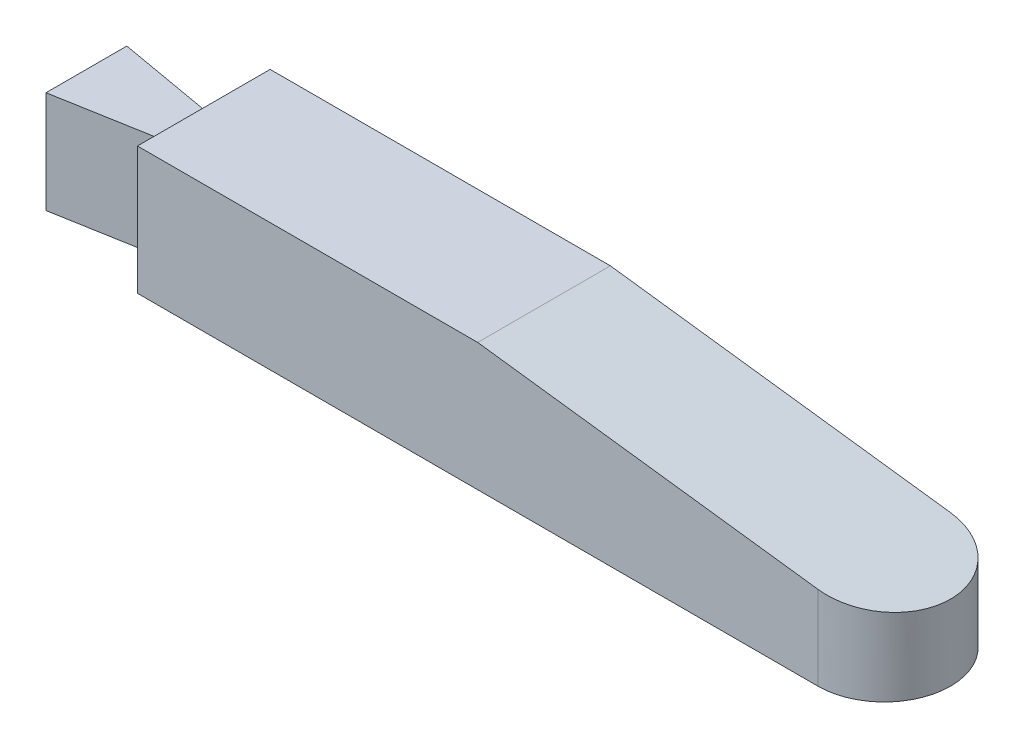
ISO-10303-21;
HEADER;
FILE_DESCRIPTION(('STEP AP214'),'2;1');
FILE_NAME('part.step','',(''),(''),'','','');
FILE_SCHEMA(('AUTOMOTIVE_DESIGN { 1 0 10303 214 1 1 1 1 }'));
ENDSEC;
DATA;
#1=APPLICATION_CONTEXT('core data for automotive mechanical design processes');
#2=APPLICATION_PROTOCOL_DEFINITION('international standard','automotive_design',2000,#1);
#3=PRODUCT_CONTEXT('',#1,'mechanical');
#4=PRODUCT('Part','Part','',(#3));
#5=PRODUCT_RELATED_PRODUCT_CATEGORY('part','',(#4));
#6=PRODUCT_DEFINITION_FORMATION('','',#4);
#7=PRODUCT_DEFINITION_CONTEXT('part definition',#1,'design');
#8=PRODUCT_DEFINITION('design','',#6,#7);
#9=PRODUCT_DEFINITION_SHAPE('','',#8);
#10=(LENGTH_UNIT() NAMED_UNIT(*) SI_UNIT(.MILLI.,.METRE.));
#11=(NAMED_UNIT(*) PLANE_ANGLE_UNIT() SI_UNIT($,.RADIAN.));
#12=(NAMED_UNIT(*) SI_UNIT($,.STERADIAN.) SOLID_ANGLE_UNIT());
#13=UNCERTAINTY_MEASURE_WITH_UNIT(LENGTH_MEASURE(1.E-05),#10,'distance_accuracy_value','');
#14=(GEOMETRIC_REPRESENTATION_CONTEXT(3) GLOBAL_UNCERTAINTY_ASSIGNED_CONTEXT((#13)) GLOBAL_UNIT_ASSIGNED_CONTEXT((#10,
#11,#12)) REPRESENTATION_CONTEXT('',''));
#15=CARTESIAN_POINT('',(0.,0.,0.));
#16=DIRECTION('',(0.,0.,1.));
#17=DIRECTION('',(1.,0.,0.));
#18=AXIS2_PLACEMENT_3D('',#15,#16,#17);
#19=CARTESIAN_POINT('',(-35.052,38.1,7.74700000000001));
#20=DIRECTION('',(-0.173648177666927,0.,0.984807753012209));
#21=DIRECTION('',(0.984807753012209,0.,0.173648177666927));
#22=AXIS2_PLACEMENT_3D('',#19,#20,#21);
#23=PLANE('',#22);
#24=DIRECTION('',(-0.984807753012209,0.,-0.173648177666928));
#25=VECTOR('',#24,1.);
#26=CARTESIAN_POINT('',(0.,30.48,13.927613327793));
#27=LINE('',#26,#25);
#28=CARTESIAN_POINT('',(0.,30.48,13.927613327793));
#29=VERTEX_POINT('',#28);
#30=CARTESIAN_POINT('',(-35.052,30.48,7.74700000000001));
#31=VERTEX_POINT('',#30);
#32=EDGE_CURVE('E198',#29,#31,#27,.T.);
#33=ORIENTED_EDGE('',*,*,#32,.F.);
#34=DIRECTION('',(0.,-1.,0.));
#35=VECTOR('',#34,1.);
#36=CARTESIAN_POINT('',(0.,38.1,13.927613327793));
#37=LINE('',#36,#35);
#38=CARTESIAN_POINT('',(0.,0.,13.927613327793));
#39=VERTEX_POINT('',#38);
#40=EDGE_CURVE('E11',#29,#39,#37,.T.);
#41=ORIENTED_EDGE('',*,*,#40,.T.);
#42=DIRECTION('',(-0.984807753012209,0.,-0.173648177666928));
#43=VECTOR('',#42,1.);
#44=CARTESIAN_POINT('',(-35.052,0.,7.74700000000001));
#45=LINE('',#44,#43);
#46=CARTESIAN_POINT('',(-35.052,0.,7.74700000000001));
#47=VERTEX_POINT('',#46);
#48=EDGE_CURVE('E124',#39,#47,#45,.T.);
#49=ORIENTED_EDGE('',*,*,#48,.T.);
#50=DIRECTION('',(0.,-1.,0.));
#51=VECTOR('',#50,1.);
#52=CARTESIAN_POINT('',(-35.052,38.1,7.74700000000001));
#53=LINE('',#52,#51);
#54=EDGE_CURVE('E53',#31,#47,#53,.T.);
#55=ORIENTED_EDGE('',*,*,#54,.F.);
#56=EDGE_LOOP('',(#33,#41,#49,#55));
#57=FACE_BOUND('',#56,.T.);
#58=ADVANCED_FACE('F45',(#57),#23,.F.);
#59=CARTESIAN_POINT('',(-35.052,38.1,7.74700000000001));
#60=DIRECTION('',(1.,0.,0.));
#61=DIRECTION('',(0.,0.,-1.));
#62=AXIS2_PLACEMENT_3D('',#59,#60,#61);
#63=PLANE('',#62);
#64=DIRECTION('',(0.,0.,1.));
#65=VECTOR('',#64,1.);
#66=CARTESIAN_POINT('',(-35.052,30.48,7.74700000000001));
#67=LINE('',#66,#65);
#68=CARTESIAN_POINT('',(-35.052,30.48,31.877));
#69=VERTEX_POINT('',#68);
#70=EDGE_CURVE('E177',#31,#69,#67,.T.);
#71=ORIENTED_EDGE('',*,*,#70,.F.);
#72=ORIENTED_EDGE('',*,*,#54,.T.);
#73=DIRECTION('',(0.,0.,1.));
#74=VECTOR('',#73,1.);
#75=CARTESIAN_POINT('',(-35.052,0.,7.74700000000001));
#76=LINE('',#75,#74);
#77=CARTESIAN_POINT('',(-35.052,0.,31.877));
#78=VERTEX_POINT('',#77);
#79=EDGE_CURVE('E130',#47,#78,#76,.T.);
#80=ORIENTED_EDGE('',*,*,#79,.T.);
#81=DIRECTION('',(0.,-1.,0.));
#82=VECTOR('',#81,1.);
#83=CARTESIAN_POINT('',(-35.052,38.1,31.877));
#84=LINE('',#83,#82);
#85=EDGE_CURVE('E166',#69,#78,#84,.T.);
#86=ORIENTED_EDGE('',*,*,#85,.F.);
#87=EDGE_LOOP('',(#71,#72,#80,#86));
#88=FACE_BOUND('',#87,.T.);
#89=ADVANCED_FACE('F172',(#88),#63,.F.);
#90=CARTESIAN_POINT('',(-35.052,38.1,31.877));
#91=DIRECTION('',(-0.173648177666928,0.,-0.984807753012209));
#92=DIRECTION('',(-0.984807753012209,0.,0.173648177666928));
#93=AXIS2_PLACEMENT_3D('',#90,#91,#92);
#94=PLANE('',#93);
#95=DIRECTION('',(0.984807753012208,0.,-0.173648177666928));
#96=VECTOR('',#95,1.);
#97=CARTESIAN_POINT('',(-35.052,30.48,31.877));
#98=LINE('',#97,#96);
#99=CARTESIAN_POINT('',(0.,30.48,25.696386672207));
#100=VERTEX_POINT('',#99);
#101=EDGE_CURVE('E133',#69,#100,#98,.T.);
#102=ORIENTED_EDGE('',*,*,#101,.F.);
#103=ORIENTED_EDGE('',*,*,#85,.T.);
#104=DIRECTION('',(0.984807753012208,0.,-0.173648177666928));
#105=VECTOR('',#104,1.);
#106=CARTESIAN_POINT('',(-35.052,0.,31.877));
#107=LINE('',#106,#105);
#108=CARTESIAN_POINT('',(0.,0.,25.696386672207));
#109=VERTEX_POINT('',#108);
#110=EDGE_CURVE('E141',#78,#109,#107,.T.);
#111=ORIENTED_EDGE('',*,*,#110,.T.);
#112=DIRECTION('',(0.,-1.,0.));
#113=VECTOR('',#112,1.);
#114=CARTESIAN_POINT('',(0.,38.1,25.696386672207));
#115=LINE('',#114,#113);
#116=EDGE_CURVE('E163',#100,#109,#115,.T.);
#117=ORIENTED_EDGE('',*,*,#116,.F.);
#118=EDGE_LOOP('',(#102,#103,#111,#117));
#119=FACE_BOUND('',#118,.T.);
#120=ADVANCED_FACE('F185',(#119),#94,.F.);
#121=CARTESIAN_POINT('',(0.,38.1,39.624));
#122=DIRECTION('',(1.,0.,0.));
#123=DIRECTION('',(0.,0.,-1.));
#124=AXIS2_PLACEMENT_3D('',#121,#122,#123);
#125=PLANE('',#124);
#126=DIRECTION('',(0.,0.,1.));
#127=VECTOR('',#126,1.);
#128=CARTESIAN_POINT('',(0.,0.,39.624));
#129=LINE('',#128,#127);
#130=CARTESIAN_POINT('',(0.,0.,39.624));
#131=VERTEX_POINT('',#130);
#132=EDGE_CURVE('E145',#109,#131,#129,.T.);
#133=ORIENTED_EDGE('',*,*,#132,.T.);
#134=DIRECTION('',(0.,-1.,0.));
#135=VECTOR('',#134,1.);
#136=CARTESIAN_POINT('',(0.,38.1,39.624));
#137=LINE('',#136,#135);
#138=CARTESIAN_POINT('',(0.,38.1,39.624));
#139=VERTEX_POINT('',#138);
#140=EDGE_CURVE('E159',#139,#131,#137,.T.);
#141=ORIENTED_EDGE('',*,*,#140,.F.);
#142=DIRECTION('',(0.,0.,1.));
#143=VECTOR('',#142,1.);
#144=CARTESIAN_POINT('',(0.,38.1,0.));
#145=LINE('',#144,#143);
#146=CARTESIAN_POINT('',(0.,38.1,0.));
#147=VERTEX_POINT('',#146);
#148=EDGE_CURVE('E109',#147,#139,#145,.T.);
#149=ORIENTED_EDGE('',*,*,#148,.F.);
#150=DIRECTION('',(0.,-1.,0.));
#151=VECTOR('',#150,1.);
#152=CARTESIAN_POINT('',(0.,38.1,0.));
#153=LINE('',#152,#151);
#154=CARTESIAN_POINT('',(0.,0.,0.));
#155=VERTEX_POINT('',#154);
#156=EDGE_CURVE('E100',#147,#155,#153,.T.);
#157=ORIENTED_EDGE('',*,*,#156,.T.);
#158=DIRECTION('',(0.,0.,1.));
#159=VECTOR('',#158,1.);
#160=CARTESIAN_POINT('',(0.,0.,0.));
#161=LINE('',#160,#159);
#162=EDGE_CURVE('E116',#155,#39,#161,.T.);
#163=ORIENTED_EDGE('',*,*,#162,.T.);
#164=ORIENTED_EDGE('',*,*,#40,.F.);
#165=DIRECTION('',(0.,0.,-1.));
#166=VECTOR('',#165,1.);
#167=CARTESIAN_POINT('',(0.,30.48,25.696386672207));
#168=LINE('',#167,#166);
#169=EDGE_CURVE('E126',#100,#29,#168,.T.);
#170=ORIENTED_EDGE('',*,*,#169,.F.);
#171=ORIENTED_EDGE('',*,*,#116,.T.);
#172=EDGE_LOOP('',(#133,#141,#149,#157,#163,#164,#170,#171));
#173=FACE_BOUND('',#172,.T.);
#174=ADVANCED_FACE('F114',(#173),#125,.F.);
#175=CARTESIAN_POINT('',(0.,38.1,39.624));
#176=DIRECTION('',(0.,0.,-1.));
#177=DIRECTION('',(-1.,0.,0.));
#178=AXIS2_PLACEMENT_3D('',#175,#176,#177);
#179=PLANE('',#178);
#180=DIRECTION('',(0.,-1.,0.));
#181=VECTOR('',#180,1.);
#182=CARTESIAN_POINT('',(203.2,38.1,39.6239999999999));
#183=LINE('',#182,#181);
#184=CARTESIAN_POINT('',(203.2,25.062054565206,39.624));
#185=VERTEX_POINT('',#184);
#186=CARTESIAN_POINT('',(203.2,0.,39.6239999999999));
#187=VERTEX_POINT('',#186);
#188=EDGE_CURVE('E156',#185,#187,#183,.T.);
#189=ORIENTED_EDGE('',*,*,#188,.F.);
#190=DIRECTION('',(0.99186650650236,-0.127282493999779,0.));
#191=VECTOR('',#190,1.);
#192=CARTESIAN_POINT('',(101.6,38.1,39.624));
#193=LINE('',#192,#191);
#194=CARTESIAN_POINT('',(101.6,38.1,39.624));
#195=VERTEX_POINT('',#194);
#196=EDGE_CURVE('E227',#195,#185,#193,.T.);
#197=ORIENTED_EDGE('',*,*,#196,.F.);
#198=DIRECTION('',(1.,0.,0.));
#199=VECTOR('',#198,1.);
#200=CARTESIAN_POINT('',(0.,38.1,39.624));
#201=LINE('',#200,#199);
#202=EDGE_CURVE('E213',#139,#195,#201,.T.);
#203=ORIENTED_EDGE('',*,*,#202,.F.);
#204=ORIENTED_EDGE('',*,*,#140,.T.);
#205=DIRECTION('',(1.,0.,0.));
#206=VECTOR('',#205,1.);
#207=CARTESIAN_POINT('',(0.,0.,39.624));
#208=LINE('',#207,#206);
#209=EDGE_CURVE('E148',#131,#187,#208,.T.);
#210=ORIENTED_EDGE('',*,*,#209,.T.);
#211=EDGE_LOOP('',(#189,#197,#203,#204,#210));
#212=FACE_BOUND('',#211,.T.);
#213=ADVANCED_FACE('F225',(#212),#179,.F.);
#214=CARTESIAN_POINT('',(203.2,38.1,19.812));
#215=DIRECTION('',(0.,-1.,0.));
#216=DIRECTION('',(0.,0.,-1.));
#217=AXIS2_PLACEMENT_3D('',#214,#215,#216);
#218=CYLINDRICAL_SURFACE('',#217,19.8119999999999);
#219=CARTESIAN_POINT('',(203.2,25.062054565206,19.812));
#220=DIRECTION('',(-0.127282493999779,-0.99186650650236,0.));
#221=DIRECTION('',(0.99186650650236,-0.127282493999779,0.));
#222=AXIS2_PLACEMENT_3D('',#219,#220,#221);
#223=ELLIPSE('',#222,19.9744621580816,19.8119999999999);
#224=CARTESIAN_POINT('',(203.2,25.062054565206,0.));
#225=VERTEX_POINT('',#224);
#226=EDGE_CURVE('E200',#225,#185,#223,.T.);
#227=ORIENTED_EDGE('',*,*,#226,.T.);
#228=ORIENTED_EDGE('',*,*,#188,.T.);
#229=CARTESIAN_POINT('',(203.2,0.,19.812));
#230=DIRECTION('',(0.,1.,0.));
#231=DIRECTION('',(0.,0.,-1.));
#232=AXIS2_PLACEMENT_3D('',#229,#230,#231);
#233=CIRCLE('',#232,19.8119999999999);
#234=CARTESIAN_POINT('',(203.2,0.,0.));
#235=VERTEX_POINT('',#234);
#236=EDGE_CURVE('E110',#187,#235,#233,.T.);
#237=ORIENTED_EDGE('',*,*,#236,.T.);
#238=DIRECTION('',(0.,-1.,0.));
#239=VECTOR('',#238,1.);
#240=CARTESIAN_POINT('',(203.2,38.1,0.));
#241=LINE('',#240,#239);
#242=EDGE_CURVE('E103',#225,#235,#241,.T.);
#243=ORIENTED_EDGE('',*,*,#242,.F.);
#244=EDGE_LOOP('',(#227,#228,#237,#243));
#245=FACE_BOUND('',#244,.T.);
#246=ADVANCED_FACE('F255',(#245),#218,.T.);
#247=CARTESIAN_POINT('',(0.,38.1,0.));
#248=DIRECTION('',(0.,0.,1.));
#249=DIRECTION('',(1.,0.,0.));
#250=AXIS2_PLACEMENT_3D('',#247,#248,#249);
#251=PLANE('',#250);
#252=DIRECTION('',(-1.,0.,0.));
#253=VECTOR('',#252,1.);
#254=CARTESIAN_POINT('',(0.,38.1,0.));
#255=LINE('',#254,#253);
#256=CARTESIAN_POINT('',(101.6,38.1,0.));
#257=VERTEX_POINT('',#256);
#258=EDGE_CURVE('E68',#257,#147,#255,.T.);
#259=ORIENTED_EDGE('',*,*,#258,.F.);
#260=DIRECTION('',(0.99186650650236,-0.127282493999779,0.));
#261=VECTOR('',#260,1.);
#262=CARTESIAN_POINT('',(101.6,38.1,0.));
#263=LINE('',#262,#261);
#264=EDGE_CURVE('E60',#257,#225,#263,.T.);
#265=ORIENTED_EDGE('',*,*,#264,.T.);
#266=ORIENTED_EDGE('',*,*,#242,.T.);
#267=DIRECTION('',(-1.,0.,0.));
#268=VECTOR('',#267,1.);
#269=CARTESIAN_POINT('',(0.,0.,0.));
#270=LINE('',#269,#268);
#271=EDGE_CURVE('E97',#235,#155,#270,.T.);
#272=ORIENTED_EDGE('',*,*,#271,.T.);
#273=ORIENTED_EDGE('',*,*,#156,.F.);
#274=EDGE_LOOP('',(#259,#265,#266,#272,#273));
#275=FACE_BOUND('',#274,.T.);
#276=ADVANCED_FACE('F99',(#275),#251,.F.);
#277=CARTESIAN_POINT('',(203.2,38.1,19.812));
#278=DIRECTION('',(0.,-1.,0.));
#279=DIRECTION('',(0.,0.,-1.));
#280=AXIS2_PLACEMENT_3D('',#277,#278,#279);
#281=PLANE('',#280);
#282=ORIENTED_EDGE('',*,*,#202,.T.);
#283=DIRECTION('',(0.,0.,1.));
#284=VECTOR('',#283,1.);
#285=CARTESIAN_POINT('',(101.6,38.1,0.));
#286=LINE('',#285,#284);
#287=EDGE_CURVE('E206',#257,#195,#286,.T.);
#288=ORIENTED_EDGE('',*,*,#287,.F.);
#289=ORIENTED_EDGE('',*,*,#258,.T.);
#290=ORIENTED_EDGE('',*,*,#148,.T.);
#291=EDGE_LOOP('',(#282,#288,#289,#290));
#292=FACE_BOUND('',#291,.T.);
#293=ADVANCED_FACE('F219',(#292),#281,.F.);
#294=CARTESIAN_POINT('',(203.2,0.,19.812));
#295=DIRECTION('',(0.,-1.,0.));
#296=DIRECTION('',(0.,0.,-1.));
#297=AXIS2_PLACEMENT_3D('',#294,#295,#296);
#298=PLANE('',#297);
#299=ORIENTED_EDGE('',*,*,#162,.F.);
#300=ORIENTED_EDGE('',*,*,#271,.F.);
#301=ORIENTED_EDGE('',*,*,#236,.F.);
#302=ORIENTED_EDGE('',*,*,#209,.F.);
#303=ORIENTED_EDGE('',*,*,#132,.F.);
#304=ORIENTED_EDGE('',*,*,#110,.F.);
#305=ORIENTED_EDGE('',*,*,#79,.F.);
#306=ORIENTED_EDGE('',*,*,#48,.F.);
#307=EDGE_LOOP('',(#299,#300,#301,#302,#303,#304,#305,#306));
#308=FACE_BOUND('',#307,.T.);
#309=ADVANCED_FACE('F121',(#308),#298,.T.);
#310=CARTESIAN_POINT('',(0.,30.48,0.));
#311=DIRECTION('',(0.,1.,0.));
#312=DIRECTION('',(0.,0.,1.));
#313=AXIS2_PLACEMENT_3D('',#310,#311,#312);
#314=PLANE('',#313);
#315=ORIENTED_EDGE('',*,*,#32,.T.);
#316=ORIENTED_EDGE('',*,*,#70,.T.);
#317=ORIENTED_EDGE('',*,*,#101,.T.);
#318=ORIENTED_EDGE('',*,*,#169,.T.);
#319=EDGE_LOOP('',(#315,#316,#317,#318));
#320=FACE_BOUND('',#319,.T.);
#321=ADVANCED_FACE('F197',(#320),#314,.T.);
#322=CARTESIAN_POINT('',(101.6,38.1,0.));
#323=DIRECTION('',(-0.127282493999779,-0.99186650650236,0.));
#324=DIRECTION('',(0.99186650650236,-0.127282493999779,0.));
#325=AXIS2_PLACEMENT_3D('',#322,#323,#324);
#326=PLANE('',#325);
#327=ORIENTED_EDGE('',*,*,#226,.F.);
#328=ORIENTED_EDGE('',*,*,#264,.F.);
#329=ORIENTED_EDGE('',*,*,#287,.T.);
#330=ORIENTED_EDGE('',*,*,#196,.T.);
#331=EDGE_LOOP('',(#327,#328,#329,#330));
#332=FACE_BOUND('',#331,.T.);
#333=ADVANCED_FACE('F233',(#332),#326,.F.);
#334=CLOSED_SHELL('',(#58,#89,#120,#174,#213,#246,#276,#293,#309,#321,#333));
#335=MANIFOLD_SOLID_BREP('B2',#334);
#336=ADVANCED_BREP_SHAPE_REPRESENTATION('',(#18,#335),#14);
#337=SHAPE_DEFINITION_REPRESENTATION(#9,#336);
ENDSEC;
END-ISO-10303-21;
